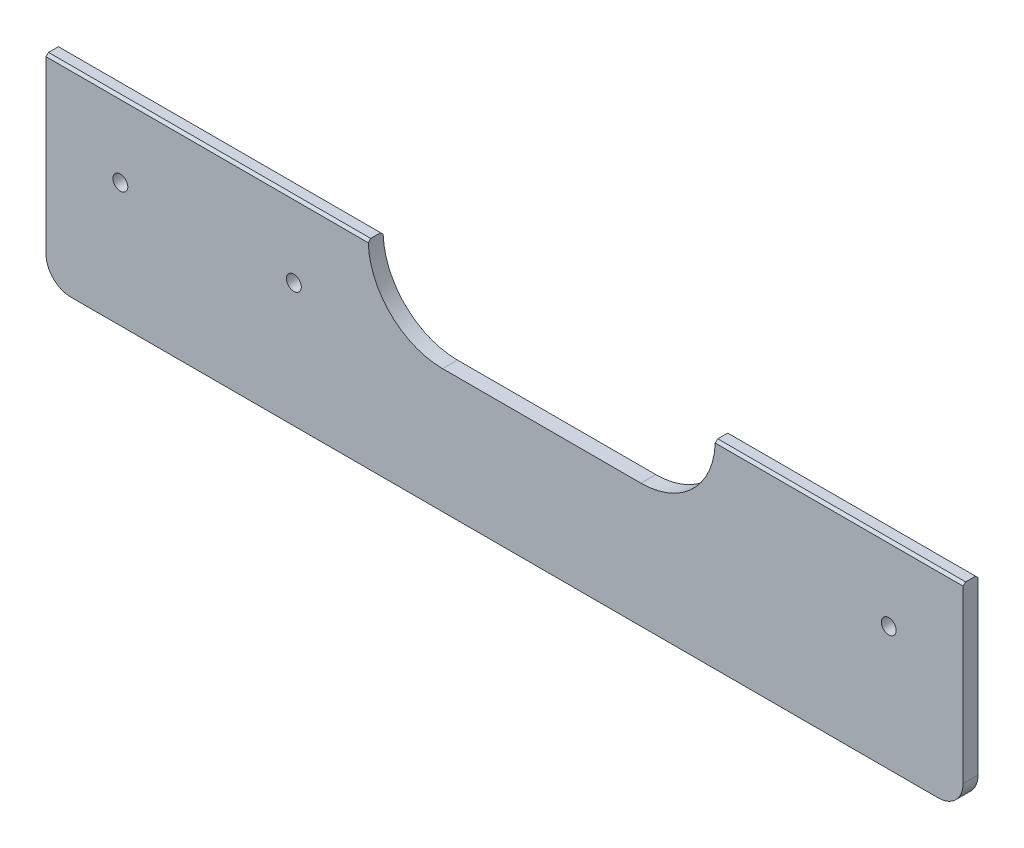
ISO-10303-21;
HEADER;
FILE_DESCRIPTION(('STEP AP214'),'2;1');
FILE_NAME('part.step','',(''),(''),'','','');
FILE_SCHEMA(('AUTOMOTIVE_DESIGN { 1 0 10303 214 1 1 1 1 }'));
ENDSEC;
DATA;
#1=APPLICATION_CONTEXT('core data for automotive mechanical design processes');
#2=APPLICATION_PROTOCOL_DEFINITION('international standard','automotive_design',2000,#1);
#3=PRODUCT_CONTEXT('',#1,'mechanical');
#4=PRODUCT('Part','Part','',(#3));
#5=PRODUCT_RELATED_PRODUCT_CATEGORY('part','',(#4));
#6=PRODUCT_DEFINITION_FORMATION('','',#4);
#7=PRODUCT_DEFINITION_CONTEXT('part definition',#1,'design');
#8=PRODUCT_DEFINITION('design','',#6,#7);
#9=PRODUCT_DEFINITION_SHAPE('','',#8);
#10=(LENGTH_UNIT() NAMED_UNIT(*) SI_UNIT(.MILLI.,.METRE.));
#11=(NAMED_UNIT(*) PLANE_ANGLE_UNIT() SI_UNIT($,.RADIAN.));
#12=(NAMED_UNIT(*) SI_UNIT($,.STERADIAN.) SOLID_ANGLE_UNIT());
#13=UNCERTAINTY_MEASURE_WITH_UNIT(LENGTH_MEASURE(1.E-05),#10,'distance_accuracy_value','');
#14=(GEOMETRIC_REPRESENTATION_CONTEXT(3) GLOBAL_UNCERTAINTY_ASSIGNED_CONTEXT((#13)) GLOBAL_UNIT_ASSIGNED_CONTEXT((#10,
#11,#12)) REPRESENTATION_CONTEXT('',''));
#15=CARTESIAN_POINT('',(0.,0.,0.));
#16=DIRECTION('',(0.,0.,1.));
#17=DIRECTION('',(1.,0.,0.));
#18=AXIS2_PLACEMENT_3D('',#15,#16,#17);
#19=CARTESIAN_POINT('',(-110.,15.,3.));
#20=DIRECTION('',(0.,-1.,0.));
#21=DIRECTION('',(0.,0.,-1.));
#22=AXIS2_PLACEMENT_3D('',#19,#20,#21);
#23=PLANE('',#22);
#24=DIRECTION('',(0.,0.,1.));
#25=VECTOR('',#24,1.);
#26=CARTESIAN_POINT('',(-45.,15.,0.));
#27=LINE('',#26,#25);
#28=CARTESIAN_POINT('',(-45.,15.,2.5));
#29=VERTEX_POINT('',#28);
#30=CARTESIAN_POINT('',(-45.,15.,0.5));
#31=VERTEX_POINT('',#30);
#32=EDGE_CURVE('E203',#29,#31,#27,.F.);
#33=ORIENTED_EDGE('',*,*,#32,.T.);
#34=DIRECTION('',(-1.,0.,0.));
#35=VECTOR('',#34,1.);
#36=CARTESIAN_POINT('',(-110.,15.,0.5));
#37=LINE('',#36,#35);
#38=CARTESIAN_POINT('',(-110.,15.,0.5));
#39=VERTEX_POINT('',#38);
#40=EDGE_CURVE('E306',#31,#39,#37,.T.);
#41=ORIENTED_EDGE('',*,*,#40,.T.);
#42=DIRECTION('',(0.,0.,-1.));
#43=VECTOR('',#42,1.);
#44=CARTESIAN_POINT('',(-110.,15.,3.));
#45=LINE('',#44,#43);
#46=CARTESIAN_POINT('',(-110.,15.,2.5));
#47=VERTEX_POINT('',#46);
#48=EDGE_CURVE('E236',#47,#39,#45,.T.);
#49=ORIENTED_EDGE('',*,*,#48,.F.);
#50=DIRECTION('',(1.,0.,0.));
#51=VECTOR('',#50,1.);
#52=CARTESIAN_POINT('',(-45.,15.,2.5));
#53=LINE('',#52,#51);
#54=EDGE_CURVE('E303',#47,#29,#53,.T.);
#55=ORIENTED_EDGE('',*,*,#54,.T.);
#56=EDGE_LOOP('',(#33,#41,#49,#55));
#57=FACE_BOUND('',#56,.T.);
#58=ADVANCED_FACE('F46',(#57),#23,.F.);
#59=CARTESIAN_POINT('',(-110.,15.,3.));
#60=DIRECTION('',(1.,0.,0.));
#61=DIRECTION('',(0.,0.,-1.));
#62=AXIS2_PLACEMENT_3D('',#59,#60,#61);
#63=PLANE('',#62);
#64=ORIENTED_EDGE('',*,*,#48,.T.);
#65=DIRECTION('',(0.,0.707106781186548,0.707106781186548));
#66=VECTOR('',#65,1.);
#67=CARTESIAN_POINT('',(-110.,15.,0.5));
#68=LINE('',#67,#66);
#69=CARTESIAN_POINT('',(-110.,14.5,0.));
#70=VERTEX_POINT('',#69);
#71=EDGE_CURVE('E312',#39,#70,#68,.F.);
#72=ORIENTED_EDGE('',*,*,#71,.T.);
#73=DIRECTION('',(0.,-1.,0.));
#74=VECTOR('',#73,1.);
#75=CARTESIAN_POINT('',(-110.,15.,0.));
#76=LINE('',#75,#74);
#77=CARTESIAN_POINT('',(-110.,-20.,0.));
#78=VERTEX_POINT('',#77);
#79=EDGE_CURVE('E212',#70,#78,#76,.T.);
#80=ORIENTED_EDGE('',*,*,#79,.T.);
#81=DIRECTION('',(0.,0.,-1.));
#82=VECTOR('',#81,1.);
#83=CARTESIAN_POINT('',(-110.,-20.,3.));
#84=LINE('',#83,#82);
#85=CARTESIAN_POINT('',(-110.,-20.,3.));
#86=VERTEX_POINT('',#85);
#87=EDGE_CURVE('E265',#78,#86,#84,.F.);
#88=ORIENTED_EDGE('',*,*,#87,.T.);
#89=DIRECTION('',(0.,-1.,0.));
#90=VECTOR('',#89,1.);
#91=CARTESIAN_POINT('',(-110.,15.,3.));
#92=LINE('',#91,#90);
#93=CARTESIAN_POINT('',(-110.,14.5,3.));
#94=VERTEX_POINT('',#93);
#95=EDGE_CURVE('E224',#94,#86,#92,.T.);
#96=ORIENTED_EDGE('',*,*,#95,.F.);
#97=DIRECTION('',(0.,0.707106781186548,-0.707106781186548));
#98=VECTOR('',#97,1.);
#99=CARTESIAN_POINT('',(-110.,14.5,3.));
#100=LINE('',#99,#98);
#101=EDGE_CURVE('E71',#94,#47,#100,.T.);
#102=ORIENTED_EDGE('',*,*,#101,.T.);
#103=EDGE_LOOP('',(#64,#72,#80,#88,#96,#102));
#104=FACE_BOUND('',#103,.T.);
#105=ADVANCED_FACE('F325',(#104),#63,.F.);
#106=CARTESIAN_POINT('',(-110.,-25.,3.));
#107=DIRECTION('',(0.,1.,0.));
#108=DIRECTION('',(-1.,0.,0.));
#109=AXIS2_PLACEMENT_3D('',#106,#107,#108);
#110=PLANE('',#109);
#111=DIRECTION('',(1.,0.,0.));
#112=VECTOR('',#111,1.);
#113=CARTESIAN_POINT('',(-110.,-25.,3.));
#114=LINE('',#113,#112);
#115=CARTESIAN_POINT('',(-105.,-25.,3.));
#116=VERTEX_POINT('',#115);
#117=CARTESIAN_POINT('',(70.,-25.,3.));
#118=VERTEX_POINT('',#117);
#119=EDGE_CURVE('E227',#116,#118,#114,.T.);
#120=ORIENTED_EDGE('',*,*,#119,.F.);
#121=DIRECTION('',(0.,0.,-1.));
#122=VECTOR('',#121,1.);
#123=CARTESIAN_POINT('',(-105.,-25.,3.));
#124=LINE('',#123,#122);
#125=CARTESIAN_POINT('',(-105.,-25.,0.));
#126=VERTEX_POINT('',#125);
#127=EDGE_CURVE('E254',#116,#126,#124,.T.);
#128=ORIENTED_EDGE('',*,*,#127,.T.);
#129=DIRECTION('',(1.,0.,0.));
#130=VECTOR('',#129,1.);
#131=CARTESIAN_POINT('',(-110.,-25.,0.));
#132=LINE('',#131,#130);
#133=CARTESIAN_POINT('',(70.,-25.,0.));
#134=VERTEX_POINT('',#133);
#135=EDGE_CURVE('E239',#126,#134,#132,.T.);
#136=ORIENTED_EDGE('',*,*,#135,.T.);
#137=DIRECTION('',(0.,0.,-1.));
#138=VECTOR('',#137,1.);
#139=CARTESIAN_POINT('',(70.,-25.,3.));
#140=LINE('',#139,#138);
#141=EDGE_CURVE('E163',#134,#118,#140,.F.);
#142=ORIENTED_EDGE('',*,*,#141,.T.);
#143=EDGE_LOOP('',(#120,#128,#136,#142));
#144=FACE_BOUND('',#143,.T.);
#145=ADVANCED_FACE('F335',(#144),#110,.F.);
#146=CARTESIAN_POINT('',(75.,15.,3.));
#147=DIRECTION('',(-1.,0.,0.));
#148=DIRECTION('',(0.,0.,1.));
#149=AXIS2_PLACEMENT_3D('',#146,#147,#148);
#150=PLANE('',#149);
#151=DIRECTION('',(0.,1.,0.));
#152=VECTOR('',#151,1.);
#153=CARTESIAN_POINT('',(75.,15.,0.));
#154=LINE('',#153,#152);
#155=CARTESIAN_POINT('',(75.,-20.,0.));
#156=VERTEX_POINT('',#155);
#157=CARTESIAN_POINT('',(75.,14.5,0.));
#158=VERTEX_POINT('',#157);
#159=EDGE_CURVE('E228',#156,#158,#154,.T.);
#160=ORIENTED_EDGE('',*,*,#159,.T.);
#161=DIRECTION('',(0.,-0.707106781186548,-0.707106781186548));
#162=VECTOR('',#161,1.);
#163=CARTESIAN_POINT('',(75.,15.,0.5));
#164=LINE('',#163,#162);
#165=CARTESIAN_POINT('',(75.,15.,0.5));
#166=VERTEX_POINT('',#165);
#167=EDGE_CURVE('E300',#158,#166,#164,.F.);
#168=ORIENTED_EDGE('',*,*,#167,.T.);
#169=DIRECTION('',(0.,0.,-1.));
#170=VECTOR('',#169,1.);
#171=CARTESIAN_POINT('',(75.,15.,3.));
#172=LINE('',#171,#170);
#173=CARTESIAN_POINT('',(75.,15.,2.5));
#174=VERTEX_POINT('',#173);
#175=EDGE_CURVE('E164',#174,#166,#172,.T.);
#176=ORIENTED_EDGE('',*,*,#175,.F.);
#177=DIRECTION('',(0.,-0.707106781186548,0.707106781186548));
#178=VECTOR('',#177,1.);
#179=CARTESIAN_POINT('',(75.,14.5,3.));
#180=LINE('',#179,#178);
#181=CARTESIAN_POINT('',(75.,14.5,3.));
#182=VERTEX_POINT('',#181);
#183=EDGE_CURVE('E297',#174,#182,#180,.T.);
#184=ORIENTED_EDGE('',*,*,#183,.T.);
#185=DIRECTION('',(0.,1.,0.));
#186=VECTOR('',#185,1.);
#187=CARTESIAN_POINT('',(75.,15.,3.));
#188=LINE('',#187,#186);
#189=CARTESIAN_POINT('',(75.,-20.,3.));
#190=VERTEX_POINT('',#189);
#191=EDGE_CURVE('E232',#190,#182,#188,.T.);
#192=ORIENTED_EDGE('',*,*,#191,.F.);
#193=DIRECTION('',(0.,0.,-1.));
#194=VECTOR('',#193,1.);
#195=CARTESIAN_POINT('',(75.,-20.,3.));
#196=LINE('',#195,#194);
#197=EDGE_CURVE('E275',#190,#156,#196,.T.);
#198=ORIENTED_EDGE('',*,*,#197,.T.);
#199=EDGE_LOOP('',(#160,#168,#176,#184,#192,#198));
#200=FACE_BOUND('',#199,.T.);
#201=ADVANCED_FACE('F344',(#200),#150,.F.);
#202=ORIENTED_EDGE('',*,*,#175,.T.);
#203=DIRECTION('',(-1.,0.,0.));
#204=VECTOR('',#203,1.);
#205=CARTESIAN_POINT('',(-110.,15.,0.5));
#206=LINE('',#205,#204);
#207=CARTESIAN_POINT('',(25.,15.,0.5));
#208=VERTEX_POINT('',#207);
#209=EDGE_CURVE('E282',#166,#208,#206,.T.);
#210=ORIENTED_EDGE('',*,*,#209,.T.);
#211=DIRECTION('',(0.,0.,1.));
#212=VECTOR('',#211,1.);
#213=CARTESIAN_POINT('',(25.,15.,0.));
#214=LINE('',#213,#212);
#215=CARTESIAN_POINT('',(25.,15.,2.5));
#216=VERTEX_POINT('',#215);
#217=EDGE_CURVE('E198',#208,#216,#214,.T.);
#218=ORIENTED_EDGE('',*,*,#217,.T.);
#219=DIRECTION('',(1.,0.,0.));
#220=VECTOR('',#219,1.);
#221=CARTESIAN_POINT('',(75.,15.,2.5));
#222=LINE('',#221,#220);
#223=EDGE_CURVE('E279',#216,#174,#222,.T.);
#224=ORIENTED_EDGE('',*,*,#223,.T.);
#225=EDGE_LOOP('',(#202,#210,#218,#224));
#226=FACE_BOUND('',#225,.T.);
#227=ADVANCED_FACE('F361',(#226),#23,.F.);
#228=CARTESIAN_POINT('',(0.,0.,3.));
#229=DIRECTION('',(0.,0.,1.));
#230=DIRECTION('',(1.,0.,0.));
#231=AXIS2_PLACEMENT_3D('',#228,#229,#230);
#232=PLANE('',#231);
#233=CARTESIAN_POINT('',(-95.,0.,3.));
#234=DIRECTION('',(0.,0.,1.));
#235=DIRECTION('',(1.,0.,0.));
#236=AXIS2_PLACEMENT_3D('',#233,#234,#235);
#237=CIRCLE('',#236,1.5);
#238=CARTESIAN_POINT('',(-93.5,0.,3.));
#239=VERTEX_POINT('',#238);
#240=EDGE_CURVE('E189',#239,#239,#237,.T.);
#241=ORIENTED_EDGE('',*,*,#240,.F.);
#242=EDGE_LOOP('',(#241));
#243=FACE_BOUND('',#242,.T.);
#244=ORIENTED_EDGE('',*,*,#191,.T.);
#245=DIRECTION('',(-1.,0.,0.));
#246=VECTOR('',#245,1.);
#247=CARTESIAN_POINT('',(25.,14.5,3.));
#248=LINE('',#247,#246);
#249=CARTESIAN_POINT('',(24.9916643505649,14.5,3.));
#250=VERTEX_POINT('',#249);
#251=EDGE_CURVE('E11',#182,#250,#248,.T.);
#252=ORIENTED_EDGE('',*,*,#251,.T.);
#253=CARTESIAN_POINT('',(10.,15.,3.));
#254=DIRECTION('',(0.,0.,1.));
#255=DIRECTION('',(1.,0.,0.));
#256=AXIS2_PLACEMENT_3D('',#253,#254,#255);
#257=CIRCLE('',#256,15.);
#258=CARTESIAN_POINT('',(9.99999999999999,0.,3.));
#259=VERTEX_POINT('',#258);
#260=EDGE_CURVE('E180',#259,#250,#257,.T.);
#261=ORIENTED_EDGE('',*,*,#260,.F.);
#262=DIRECTION('',(1.,0.,0.));
#263=VECTOR('',#262,1.);
#264=CARTESIAN_POINT('',(-30.,0.,3.));
#265=LINE('',#264,#263);
#266=CARTESIAN_POINT('',(-30.,0.,3.));
#267=VERTEX_POINT('',#266);
#268=EDGE_CURVE('E186',#267,#259,#265,.T.);
#269=ORIENTED_EDGE('',*,*,#268,.F.);
#270=CARTESIAN_POINT('',(-30.,15.,3.));
#271=DIRECTION('',(0.,0.,1.));
#272=DIRECTION('',(1.,0.,0.));
#273=AXIS2_PLACEMENT_3D('',#270,#271,#272);
#274=CIRCLE('',#273,15.);
#275=CARTESIAN_POINT('',(-44.991664350565,14.5,3.));
#276=VERTEX_POINT('',#275);
#277=EDGE_CURVE('E169',#276,#267,#274,.T.);
#278=ORIENTED_EDGE('',*,*,#277,.F.);
#279=DIRECTION('',(-1.,0.,0.));
#280=VECTOR('',#279,1.);
#281=CARTESIAN_POINT('',(-110.,14.5,3.));
#282=LINE('',#281,#280);
#283=EDGE_CURVE('E56',#276,#94,#282,.T.);
#284=ORIENTED_EDGE('',*,*,#283,.T.);
#285=ORIENTED_EDGE('',*,*,#95,.T.);
#286=CARTESIAN_POINT('',(-105.,-20.,3.));
#287=DIRECTION('',(0.,0.,1.));
#288=DIRECTION('',(1.,0.,0.));
#289=AXIS2_PLACEMENT_3D('',#286,#287,#288);
#290=CIRCLE('',#289,5.);
#291=EDGE_CURVE('E272',#86,#116,#290,.T.);
#292=ORIENTED_EDGE('',*,*,#291,.T.);
#293=ORIENTED_EDGE('',*,*,#119,.T.);
#294=CARTESIAN_POINT('',(70.,-20.,3.));
#295=DIRECTION('',(0.,0.,1.));
#296=DIRECTION('',(1.,0.,0.));
#297=AXIS2_PLACEMENT_3D('',#294,#295,#296);
#298=CIRCLE('',#297,5.);
#299=EDGE_CURVE('E269',#118,#190,#298,.T.);
#300=ORIENTED_EDGE('',*,*,#299,.T.);
#301=EDGE_LOOP('',(#244,#252,#261,#269,#278,#284,#285,#292,#293,#300));
#302=FACE_BOUND('',#301,.T.);
#303=CARTESIAN_POINT('',(60.,0.,3.));
#304=DIRECTION('',(0.,0.,1.));
#305=DIRECTION('',(1.,0.,0.));
#306=AXIS2_PLACEMENT_3D('',#303,#304,#305);
#307=CIRCLE('',#306,1.5);
#308=CARTESIAN_POINT('',(61.5,0.,3.));
#309=VERTEX_POINT('',#308);
#310=EDGE_CURVE('E213',#309,#309,#307,.T.);
#311=ORIENTED_EDGE('',*,*,#310,.F.);
#312=EDGE_LOOP('',(#311));
#313=FACE_BOUND('',#312,.T.);
#314=CARTESIAN_POINT('',(-60.,0.,3.));
#315=DIRECTION('',(0.,0.,1.));
#316=DIRECTION('',(1.,0.,0.));
#317=AXIS2_PLACEMENT_3D('',#314,#315,#316);
#318=CIRCLE('',#317,1.5);
#319=CARTESIAN_POINT('',(-58.5,0.,3.));
#320=VERTEX_POINT('',#319);
#321=EDGE_CURVE('E217',#320,#320,#318,.T.);
#322=ORIENTED_EDGE('',*,*,#321,.F.);
#323=EDGE_LOOP('',(#322));
#324=FACE_BOUND('',#323,.T.);
#325=ADVANCED_FACE('F322',(#243,#302,#313,#324),#232,.T.);
#326=CARTESIAN_POINT('',(0.,0.,0.));
#327=DIRECTION('',(0.,0.,1.));
#328=DIRECTION('',(1.,0.,0.));
#329=AXIS2_PLACEMENT_3D('',#326,#327,#328);
#330=PLANE('',#329);
#331=CARTESIAN_POINT('',(-95.,0.,0.));
#332=DIRECTION('',(0.,0.,1.));
#333=DIRECTION('',(1.,0.,0.));
#334=AXIS2_PLACEMENT_3D('',#331,#332,#333);
#335=CIRCLE('',#334,1.5);
#336=CARTESIAN_POINT('',(-93.5,0.,0.));
#337=VERTEX_POINT('',#336);
#338=EDGE_CURVE('E194',#337,#337,#335,.T.);
#339=ORIENTED_EDGE('',*,*,#338,.T.);
#340=EDGE_LOOP('',(#339));
#341=FACE_BOUND('',#340,.T.);
#342=CARTESIAN_POINT('',(10.,15.,0.));
#343=DIRECTION('',(0.,0.,1.));
#344=DIRECTION('',(1.,0.,0.));
#345=AXIS2_PLACEMENT_3D('',#342,#343,#344);
#346=CIRCLE('',#345,15.);
#347=CARTESIAN_POINT('',(9.99999999999999,0.,0.));
#348=VERTEX_POINT('',#347);
#349=CARTESIAN_POINT('',(24.9916643505649,14.5,0.));
#350=VERTEX_POINT('',#349);
#351=EDGE_CURVE('E175',#348,#350,#346,.T.);
#352=ORIENTED_EDGE('',*,*,#351,.T.);
#353=DIRECTION('',(1.,0.,0.));
#354=VECTOR('',#353,1.);
#355=CARTESIAN_POINT('',(0.,14.5,0.));
#356=LINE('',#355,#354);
#357=EDGE_CURVE('E294',#350,#158,#356,.T.);
#358=ORIENTED_EDGE('',*,*,#357,.T.);
#359=ORIENTED_EDGE('',*,*,#159,.F.);
#360=CARTESIAN_POINT('',(70.,-20.,0.));
#361=DIRECTION('',(0.,0.,1.));
#362=DIRECTION('',(1.,0.,0.));
#363=AXIS2_PLACEMENT_3D('',#360,#361,#362);
#364=CIRCLE('',#363,5.);
#365=EDGE_CURVE('E258',#156,#134,#364,.F.);
#366=ORIENTED_EDGE('',*,*,#365,.T.);
#367=ORIENTED_EDGE('',*,*,#135,.F.);
#368=CARTESIAN_POINT('',(-105.,-20.,0.));
#369=DIRECTION('',(0.,0.,1.));
#370=DIRECTION('',(1.,0.,0.));
#371=AXIS2_PLACEMENT_3D('',#368,#369,#370);
#372=CIRCLE('',#371,5.);
#373=EDGE_CURVE('E261',#126,#78,#372,.F.);
#374=ORIENTED_EDGE('',*,*,#373,.T.);
#375=ORIENTED_EDGE('',*,*,#79,.F.);
#376=DIRECTION('',(1.,0.,0.));
#377=VECTOR('',#376,1.);
#378=CARTESIAN_POINT('',(0.,14.5,0.));
#379=LINE('',#378,#377);
#380=CARTESIAN_POINT('',(-44.991664350565,14.5,0.));
#381=VERTEX_POINT('',#380);
#382=EDGE_CURVE('E160',#70,#381,#379,.T.);
#383=ORIENTED_EDGE('',*,*,#382,.T.);
#384=CARTESIAN_POINT('',(-30.,15.,0.));
#385=DIRECTION('',(0.,0.,1.));
#386=DIRECTION('',(1.,0.,0.));
#387=AXIS2_PLACEMENT_3D('',#384,#385,#386);
#388=CIRCLE('',#387,15.);
#389=CARTESIAN_POINT('',(-30.,0.,0.));
#390=VERTEX_POINT('',#389);
#391=EDGE_CURVE('E151',#381,#390,#388,.T.);
#392=ORIENTED_EDGE('',*,*,#391,.T.);
#393=DIRECTION('',(1.,0.,0.));
#394=VECTOR('',#393,1.);
#395=CARTESIAN_POINT('',(-30.,0.,0.));
#396=LINE('',#395,#394);
#397=EDGE_CURVE('E157',#390,#348,#396,.T.);
#398=ORIENTED_EDGE('',*,*,#397,.T.);
#399=EDGE_LOOP('',(#352,#358,#359,#366,#367,#374,#375,#383,#392,#398));
#400=FACE_BOUND('',#399,.T.);
#401=CARTESIAN_POINT('',(60.,0.,0.));
#402=DIRECTION('',(0.,0.,1.));
#403=DIRECTION('',(1.,0.,0.));
#404=AXIS2_PLACEMENT_3D('',#401,#402,#403);
#405=CIRCLE('',#404,1.5);
#406=CARTESIAN_POINT('',(61.5,0.,0.));
#407=VERTEX_POINT('',#406);
#408=EDGE_CURVE('E208',#407,#407,#405,.T.);
#409=ORIENTED_EDGE('',*,*,#408,.T.);
#410=EDGE_LOOP('',(#409));
#411=FACE_BOUND('',#410,.T.);
#412=CARTESIAN_POINT('',(-60.,0.,0.));
#413=DIRECTION('',(0.,0.,1.));
#414=DIRECTION('',(1.,0.,0.));
#415=AXIS2_PLACEMENT_3D('',#412,#413,#414);
#416=CIRCLE('',#415,1.5);
#417=CARTESIAN_POINT('',(-58.5,0.,0.));
#418=VERTEX_POINT('',#417);
#419=EDGE_CURVE('E207',#418,#418,#416,.T.);
#420=ORIENTED_EDGE('',*,*,#419,.T.);
#421=EDGE_LOOP('',(#420));
#422=FACE_BOUND('',#421,.T.);
#423=ADVANCED_FACE('F154',(#341,#400,#411,#422),#330,.F.);
#424=CARTESIAN_POINT('',(-60.,0.,0.));
#425=DIRECTION('',(0.,0.,1.));
#426=DIRECTION('',(1.,0.,0.));
#427=AXIS2_PLACEMENT_3D('',#424,#425,#426);
#428=CYLINDRICAL_SURFACE('',#427,1.5);
#429=ORIENTED_EDGE('',*,*,#419,.F.);
#430=EDGE_LOOP('',(#429));
#431=FACE_BOUND('',#430,.T.);
#432=ORIENTED_EDGE('',*,*,#321,.T.);
#433=EDGE_LOOP('',(#432));
#434=FACE_BOUND('',#433,.T.);
#435=ADVANCED_FACE('F476',(#431,#434),#428,.F.);
#436=CARTESIAN_POINT('',(60.,0.,0.));
#437=DIRECTION('',(0.,0.,1.));
#438=DIRECTION('',(1.,0.,0.));
#439=AXIS2_PLACEMENT_3D('',#436,#437,#438);
#440=CYLINDRICAL_SURFACE('',#439,1.5);
#441=ORIENTED_EDGE('',*,*,#408,.F.);
#442=EDGE_LOOP('',(#441));
#443=FACE_BOUND('',#442,.T.);
#444=ORIENTED_EDGE('',*,*,#310,.T.);
#445=EDGE_LOOP('',(#444));
#446=FACE_BOUND('',#445,.T.);
#447=ADVANCED_FACE('F468',(#443,#446),#440,.F.);
#448=CARTESIAN_POINT('',(-30.,15.,0.));
#449=DIRECTION('',(0.,0.,1.));
#450=DIRECTION('',(1.,0.,0.));
#451=AXIS2_PLACEMENT_3D('',#448,#449,#450);
#452=CYLINDRICAL_SURFACE('',#451,15.);
#453=ORIENTED_EDGE('',*,*,#391,.F.);
#454=CARTESIAN_POINT('',(-30.,15.,0.5));
#455=DIRECTION('',(0.,-0.707106781186547,0.707106781186547));
#456=DIRECTION('',(0.,0.707106781186548,0.707106781186548));
#457=AXIS2_PLACEMENT_3D('',#454,#455,#456);
#458=ELLIPSE('',#457,21.2132034355964,15.);
#459=EDGE_CURVE('E317',#381,#31,#458,.F.);
#460=ORIENTED_EDGE('',*,*,#459,.T.);
#461=ORIENTED_EDGE('',*,*,#32,.F.);
#462=CARTESIAN_POINT('',(-30.,15.,2.5));
#463=DIRECTION('',(0.,0.707106781186547,0.707106781186547));
#464=DIRECTION('',(0.,-0.707106781186548,0.707106781186548));
#465=AXIS2_PLACEMENT_3D('',#462,#463,#464);
#466=ELLIPSE('',#465,21.2132034355964,15.);
#467=EDGE_CURVE('E63',#29,#276,#466,.T.);
#468=ORIENTED_EDGE('',*,*,#467,.T.);
#469=ORIENTED_EDGE('',*,*,#277,.T.);
#470=DIRECTION('',(0.,0.,1.));
#471=VECTOR('',#470,1.);
#472=CARTESIAN_POINT('',(-30.,0.,0.));
#473=LINE('',#472,#471);
#474=EDGE_CURVE('E167',#390,#267,#473,.T.);
#475=ORIENTED_EDGE('',*,*,#474,.F.);
#476=EDGE_LOOP('',(#453,#460,#461,#468,#469,#475));
#477=FACE_BOUND('',#476,.T.);
#478=ADVANCED_FACE('F168',(#477),#452,.F.);
#479=CARTESIAN_POINT('',(10.,15.,0.));
#480=DIRECTION('',(0.,0.,1.));
#481=DIRECTION('',(1.,0.,0.));
#482=AXIS2_PLACEMENT_3D('',#479,#480,#481);
#483=CYLINDRICAL_SURFACE('',#482,15.);
#484=ORIENTED_EDGE('',*,*,#217,.F.);
#485=CARTESIAN_POINT('',(10.,15.,0.500000000000002));
#486=DIRECTION('',(0.,-0.707106781186547,0.707106781186547));
#487=DIRECTION('',(0.,0.707106781186548,0.707106781186548));
#488=AXIS2_PLACEMENT_3D('',#485,#486,#487);
#489=ELLIPSE('',#488,21.2132034355964,15.);
#490=EDGE_CURVE('E289',#208,#350,#489,.F.);
#491=ORIENTED_EDGE('',*,*,#490,.T.);
#492=ORIENTED_EDGE('',*,*,#351,.F.);
#493=DIRECTION('',(0.,0.,1.));
#494=VECTOR('',#493,1.);
#495=CARTESIAN_POINT('',(9.99999999999999,0.,0.));
#496=LINE('',#495,#494);
#497=EDGE_CURVE('E174',#348,#259,#496,.T.);
#498=ORIENTED_EDGE('',*,*,#497,.T.);
#499=ORIENTED_EDGE('',*,*,#260,.T.);
#500=CARTESIAN_POINT('',(10.,15.,2.5));
#501=DIRECTION('',(0.,0.707106781186547,0.707106781186547));
#502=DIRECTION('',(0.,-0.707106781186548,0.707106781186548));
#503=AXIS2_PLACEMENT_3D('',#500,#501,#502);
#504=ELLIPSE('',#503,21.2132034355964,15.);
#505=EDGE_CURVE('E286',#250,#216,#504,.T.);
#506=ORIENTED_EDGE('',*,*,#505,.T.);
#507=EDGE_LOOP('',(#484,#491,#492,#498,#499,#506));
#508=FACE_BOUND('',#507,.T.);
#509=ADVANCED_FACE('F354',(#508),#483,.F.);
#510=CARTESIAN_POINT('',(-30.,0.,0.));
#511=DIRECTION('',(0.,-1.,0.));
#512=DIRECTION('',(0.,0.,-1.));
#513=AXIS2_PLACEMENT_3D('',#510,#511,#512);
#514=PLANE('',#513);
#515=ORIENTED_EDGE('',*,*,#268,.T.);
#516=ORIENTED_EDGE('',*,*,#497,.F.);
#517=ORIENTED_EDGE('',*,*,#397,.F.);
#518=ORIENTED_EDGE('',*,*,#474,.T.);
#519=EDGE_LOOP('',(#515,#516,#517,#518));
#520=FACE_BOUND('',#519,.T.);
#521=ADVANCED_FACE('F178',(#520),#514,.F.);
#522=CARTESIAN_POINT('',(-105.,-20.,3.));
#523=DIRECTION('',(0.,0.,-1.));
#524=DIRECTION('',(-1.,0.,0.));
#525=AXIS2_PLACEMENT_3D('',#522,#523,#524);
#526=CYLINDRICAL_SURFACE('',#525,5.);
#527=ORIENTED_EDGE('',*,*,#291,.F.);
#528=ORIENTED_EDGE('',*,*,#87,.F.);
#529=ORIENTED_EDGE('',*,*,#373,.F.);
#530=ORIENTED_EDGE('',*,*,#127,.F.);
#531=EDGE_LOOP('',(#527,#528,#529,#530));
#532=FACE_BOUND('',#531,.T.);
#533=ADVANCED_FACE('F331',(#532),#526,.T.);
#534=CARTESIAN_POINT('',(70.,-20.,3.));
#535=DIRECTION('',(0.,0.,-1.));
#536=DIRECTION('',(-1.,0.,0.));
#537=AXIS2_PLACEMENT_3D('',#534,#535,#536);
#538=CYLINDRICAL_SURFACE('',#537,5.);
#539=ORIENTED_EDGE('',*,*,#299,.F.);
#540=ORIENTED_EDGE('',*,*,#141,.F.);
#541=ORIENTED_EDGE('',*,*,#365,.F.);
#542=ORIENTED_EDGE('',*,*,#197,.F.);
#543=EDGE_LOOP('',(#539,#540,#541,#542));
#544=FACE_BOUND('',#543,.T.);
#545=ADVANCED_FACE('F339',(#544),#538,.T.);
#546=CARTESIAN_POINT('',(-95.,0.,0.));
#547=DIRECTION('',(0.,0.,1.));
#548=DIRECTION('',(1.,0.,0.));
#549=AXIS2_PLACEMENT_3D('',#546,#547,#548);
#550=CYLINDRICAL_SURFACE('',#549,1.5);
#551=ORIENTED_EDGE('',*,*,#338,.F.);
#552=EDGE_LOOP('',(#551));
#553=FACE_BOUND('',#552,.T.);
#554=ORIENTED_EDGE('',*,*,#240,.T.);
#555=EDGE_LOOP('',(#554));
#556=FACE_BOUND('',#555,.T.);
#557=ADVANCED_FACE('F402',(#553,#556),#550,.F.);
#558=CARTESIAN_POINT('',(-110.,15.,0.5));
#559=DIRECTION('',(0.,-0.707106781186547,0.707106781186547));
#560=DIRECTION('',(-1.,0.,0.));
#561=AXIS2_PLACEMENT_3D('',#558,#559,#560);
#562=PLANE('',#561);
#563=ORIENTED_EDGE('',*,*,#167,.F.);
#564=ORIENTED_EDGE('',*,*,#357,.F.);
#565=ORIENTED_EDGE('',*,*,#490,.F.);
#566=ORIENTED_EDGE('',*,*,#209,.F.);
#567=EDGE_LOOP('',(#563,#564,#565,#566));
#568=FACE_BOUND('',#567,.T.);
#569=ADVANCED_FACE('F358',(#568),#562,.F.);
#570=CARTESIAN_POINT('',(-110.,15.,0.5));
#571=DIRECTION('',(0.,-0.707106781186547,0.707106781186547));
#572=DIRECTION('',(-1.,0.,0.));
#573=AXIS2_PLACEMENT_3D('',#570,#571,#572);
#574=PLANE('',#573);
#575=ORIENTED_EDGE('',*,*,#459,.F.);
#576=ORIENTED_EDGE('',*,*,#382,.F.);
#577=ORIENTED_EDGE('',*,*,#71,.F.);
#578=ORIENTED_EDGE('',*,*,#40,.F.);
#579=EDGE_LOOP('',(#575,#576,#577,#578));
#580=FACE_BOUND('',#579,.T.);
#581=ADVANCED_FACE('F381',(#580),#574,.F.);
#582=CARTESIAN_POINT('',(0.,14.5,3.));
#583=DIRECTION('',(0.,0.707106781186547,0.707106781186547));
#584=DIRECTION('',(1.,0.,0.));
#585=AXIS2_PLACEMENT_3D('',#582,#583,#584);
#586=PLANE('',#585);
#587=ORIENTED_EDGE('',*,*,#183,.F.);
#588=ORIENTED_EDGE('',*,*,#223,.F.);
#589=ORIENTED_EDGE('',*,*,#505,.F.);
#590=ORIENTED_EDGE('',*,*,#251,.F.);
#591=EDGE_LOOP('',(#587,#588,#589,#590));
#592=FACE_BOUND('',#591,.T.);
#593=ADVANCED_FACE('F350',(#592),#586,.T.);
#594=CARTESIAN_POINT('',(0.,14.5,3.));
#595=DIRECTION('',(0.,0.707106781186547,0.707106781186547));
#596=DIRECTION('',(1.,0.,0.));
#597=AXIS2_PLACEMENT_3D('',#594,#595,#596);
#598=PLANE('',#597);
#599=ORIENTED_EDGE('',*,*,#467,.F.);
#600=ORIENTED_EDGE('',*,*,#54,.F.);
#601=ORIENTED_EDGE('',*,*,#101,.F.);
#602=ORIENTED_EDGE('',*,*,#283,.F.);
#603=EDGE_LOOP('',(#599,#600,#601,#602));
#604=FACE_BOUND('',#603,.T.);
#605=ADVANCED_FACE('F49',(#604),#598,.T.);
#606=CLOSED_SHELL('',(#58,#105,#145,#201,#227,#325,#423,#435,#447,#478,#509,#521,#533,#545,#557,
#569,#581,#593,#605));
#607=MANIFOLD_SOLID_BREP('B2',#606);
#608=ADVANCED_BREP_SHAPE_REPRESENTATION('',(#18,#607),#14);
#609=SHAPE_DEFINITION_REPRESENTATION(#9,#608);
ENDSEC;
END-ISO-10303-21;
